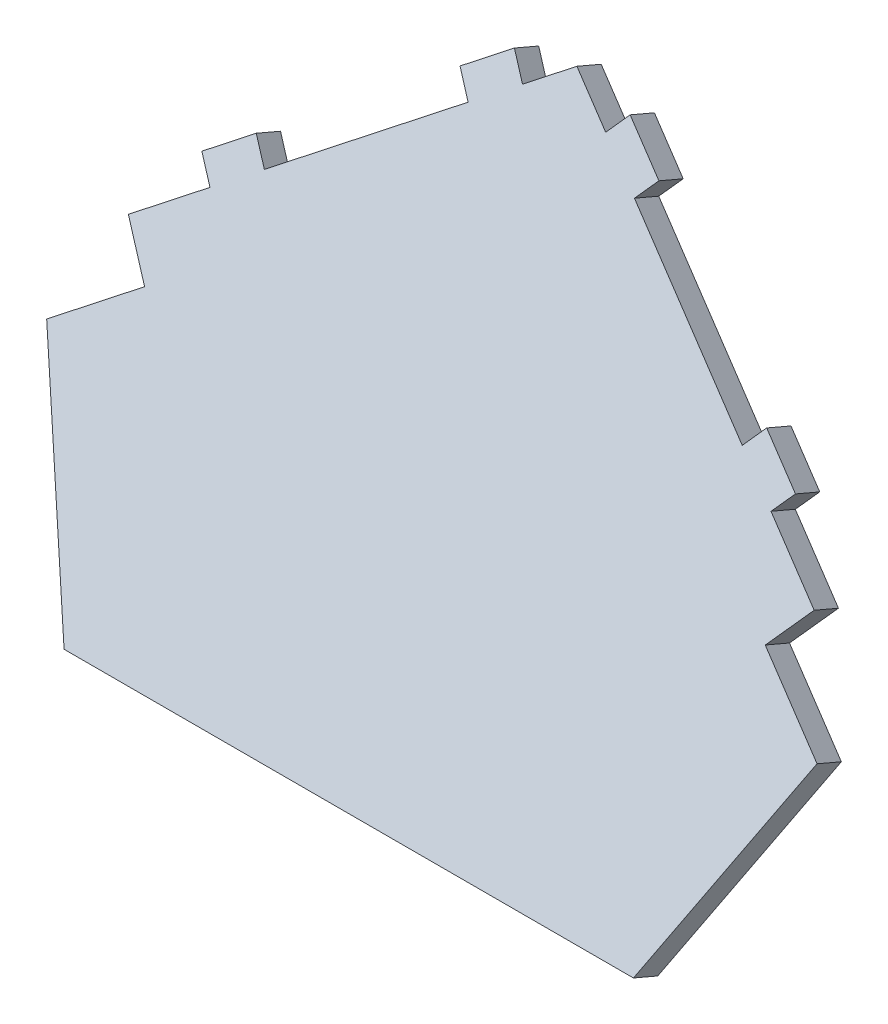
ISO-10303-21;
HEADER;
FILE_DESCRIPTION(('STEP AP214'),'2;1');
FILE_NAME('part.step','',(''),(''),'','','');
FILE_SCHEMA(('AUTOMOTIVE_DESIGN { 1 0 10303 214 1 1 1 1 }'));
ENDSEC;
DATA;
#1=APPLICATION_CONTEXT('core data for automotive mechanical design processes');
#2=APPLICATION_PROTOCOL_DEFINITION('international standard','automotive_design',2000,#1);
#3=PRODUCT_CONTEXT('',#1,'mechanical');
#4=PRODUCT('Part','Part','',(#3));
#5=PRODUCT_RELATED_PRODUCT_CATEGORY('part','',(#4));
#6=PRODUCT_DEFINITION_FORMATION('','',#4);
#7=PRODUCT_DEFINITION_CONTEXT('part definition',#1,'design');
#8=PRODUCT_DEFINITION('design','',#6,#7);
#9=PRODUCT_DEFINITION_SHAPE('','',#8);
#10=(LENGTH_UNIT() NAMED_UNIT(*) SI_UNIT(.MILLI.,.METRE.));
#11=(NAMED_UNIT(*) PLANE_ANGLE_UNIT() SI_UNIT($,.RADIAN.));
#12=(NAMED_UNIT(*) SI_UNIT($,.STERADIAN.) SOLID_ANGLE_UNIT());
#13=UNCERTAINTY_MEASURE_WITH_UNIT(LENGTH_MEASURE(1.E-05),#10,'distance_accuracy_value','');
#14=(GEOMETRIC_REPRESENTATION_CONTEXT(3) GLOBAL_UNCERTAINTY_ASSIGNED_CONTEXT((#13)) GLOBAL_UNIT_ASSIGNED_CONTEXT((#10,
#11,#12)) REPRESENTATION_CONTEXT('',''));
#15=CARTESIAN_POINT('',(0.,0.,0.));
#16=DIRECTION('',(0.,0.,1.));
#17=DIRECTION('',(1.,0.,0.));
#18=AXIS2_PLACEMENT_3D('',#15,#16,#17);
#19=CARTESIAN_POINT('',(0.,-9.20052588435934,-21.5016166865018));
#20=DIRECTION('',(0.,-0.393397156897283,-0.919368629519811));
#21=DIRECTION('',(0.,0.919368629519811,-0.393397156897283));
#22=AXIS2_PLACEMENT_3D('',#19,#20,#21);
#23=PLANE('',#22);
#24=DIRECTION('',(-0.787342411916439,-0.566805431330575,0.242535625036334));
#25=VECTOR('',#24,1.);
#26=CARTESIAN_POINT('',(-53.1157823784544,-40.2048775655227,-8.23487752314398));
#27=LINE('',#26,#25);
#28=CARTESIAN_POINT('',(-53.1157823784544,-40.2048775655227,-8.23487752314398));
#29=VERTEX_POINT('',#28);
#30=CARTESIAN_POINT('',(-64.9259185572009,-48.7069590354813,-4.59684314759898));
#31=VERTEX_POINT('',#30);
#32=EDGE_CURVE('E43',#29,#31,#27,.T.);
#33=ORIENTED_EDGE('',*,*,#32,.F.);
#34=DIRECTION('',(0.616515957942376,-0.723857914206439,0.309738266352574));
#35=VECTOR('',#34,1.);
#36=CARTESIAN_POINT('',(-53.1157823784544,-40.2048775655227,-8.23487752314398));
#37=LINE('',#36,#35);
#38=CARTESIAN_POINT('',(-56.1983621681663,-36.5855879944905,-9.78356885490686));
#39=VERTEX_POINT('',#38);
#40=EDGE_CURVE('E64',#39,#29,#37,.T.);
#41=ORIENTED_EDGE('',*,*,#40,.F.);
#42=DIRECTION('',(-0.787342411916438,-0.566805431330575,0.242535625036339));
#43=VECTOR('',#42,1.);
#44=CARTESIAN_POINT('',(-48.3249380490019,-30.9175336811847,-12.2089251052702));
#45=LINE('',#44,#43);
#46=CARTESIAN_POINT('',(-48.3249380490019,-30.9175336811847,-12.2089251052702));
#47=VERTEX_POINT('',#46);
#48=EDGE_CURVE('E73',#47,#39,#45,.T.);
#49=ORIENTED_EDGE('',*,*,#48,.F.);
#50=DIRECTION('',(-0.616515957942375,0.723857914206439,-0.309738266352574));
#51=VECTOR('',#50,1.);
#52=CARTESIAN_POINT('',(-48.3249380490019,-30.9175336811847,-12.2089251052702));
#53=LINE('',#52,#51);
#54=CARTESIAN_POINT('',(-45.24235825929,-34.5368232522169,-10.6602337735074));
#55=VERTEX_POINT('',#54);
#56=EDGE_CURVE('E80',#55,#47,#53,.T.);
#57=ORIENTED_EDGE('',*,*,#56,.F.);
#58=DIRECTION('',(-0.787342411916439,-0.566805431330577,0.24253562503633));
#59=VECTOR('',#58,1.);
#60=CARTESIAN_POINT('',(-15.7468482383288,-13.3030944110979,-19.7461306468723));
#61=LINE('',#60,#59);
#62=CARTESIAN_POINT('',(-15.7468482383288,-13.3030944110979,-19.7461306468723));
#63=VERTEX_POINT('',#62);
#64=EDGE_CURVE('E88',#63,#55,#61,.T.);
#65=ORIENTED_EDGE('',*,*,#64,.F.);
#66=DIRECTION('',(0.616515957942375,-0.72385791420644,0.309738266352575));
#67=VECTOR('',#66,1.);
#68=CARTESIAN_POINT('',(-18.8294280280407,-9.68380484006569,-21.2948219786352));
#69=LINE('',#68,#67);
#70=CARTESIAN_POINT('',(-18.8294280280407,-9.68380484006569,-21.2948219786352));
#71=VERTEX_POINT('',#70);
#72=EDGE_CURVE('E500',#71,#63,#69,.T.);
#73=ORIENTED_EDGE('',*,*,#72,.F.);
#74=DIRECTION('',(-0.787342411916439,-0.566805431330572,0.242535625036344));
#75=VECTOR('',#74,1.);
#76=CARTESIAN_POINT('',(-10.9560039088763,-4.01575052675998,-23.7201782289986));
#77=LINE('',#76,#75);
#78=CARTESIAN_POINT('',(-10.9560039088763,-4.01575052675998,-23.7201782289986));
#79=VERTEX_POINT('',#78);
#80=EDGE_CURVE('E486',#79,#71,#77,.T.);
#81=ORIENTED_EDGE('',*,*,#80,.F.);
#82=DIRECTION('',(-0.616515957942376,0.723857914206439,-0.309738266352575));
#83=VECTOR('',#82,1.);
#84=CARTESIAN_POINT('',(-7.87342411916439,-7.63504009779217,-22.1714868972357));
#85=LINE('',#84,#83);
#86=CARTESIAN_POINT('',(-7.87342411916439,-7.63504009779217,-22.1714868972357));
#87=VERTEX_POINT('',#86);
#88=EDGE_CURVE('E472',#87,#79,#85,.T.);
#89=ORIENTED_EDGE('',*,*,#88,.F.);
#90=DIRECTION('',(-0.787342411916439,-0.566805431330576,0.242535625036332));
#91=VECTOR('',#90,1.);
#92=CARTESIAN_POINT('',(0.,-1.96698578448641,-24.5968431475991));
#93=LINE('',#92,#91);
#94=CARTESIAN_POINT('',(0.,-1.96698578448641,-24.5968431475991));
#95=VERTEX_POINT('',#94);
#96=EDGE_CURVE('E458',#95,#87,#93,.T.);
#97=ORIENTED_EDGE('',*,*,#96,.F.);
#98=DIRECTION('',(-0.787342411916441,0.566805431330572,-0.242535625036335));
#99=VECTOR('',#98,1.);
#100=CARTESIAN_POINT('',(0.,-1.96698578448641,-24.5968431475991));
#101=LINE('',#100,#99);
#102=CARTESIAN_POINT('',(7.87342411916441,-7.63504009779213,-22.1714868972357));
#103=VERTEX_POINT('',#102);
#104=EDGE_CURVE('E444',#103,#95,#101,.T.);
#105=ORIENTED_EDGE('',*,*,#104,.F.);
#106=DIRECTION('',(-0.616515957942376,-0.723857914206438,0.309738266352575));
#107=VECTOR('',#106,1.);
#108=CARTESIAN_POINT('',(10.9560039088763,-4.01575052675994,-23.7201782289986));
#109=LINE('',#108,#107);
#110=CARTESIAN_POINT('',(10.9560039088763,-4.01575052675994,-23.7201782289986));
#111=VERTEX_POINT('',#110);
#112=EDGE_CURVE('E430',#111,#103,#109,.T.);
#113=ORIENTED_EDGE('',*,*,#112,.F.);
#114=DIRECTION('',(-0.787342411916439,0.566805431330576,-0.242535625036334));
#115=VECTOR('',#114,1.);
#116=CARTESIAN_POINT('',(18.8294280280407,-9.6838048400657,-21.2948219786352));
#117=LINE('',#116,#115);
#118=CARTESIAN_POINT('',(18.8294280280407,-9.6838048400657,-21.2948219786352));
#119=VERTEX_POINT('',#118);
#120=EDGE_CURVE('E416',#119,#111,#117,.T.);
#121=ORIENTED_EDGE('',*,*,#120,.F.);
#122=DIRECTION('',(0.616515957942376,0.723857914206438,-0.309738266352575));
#123=VECTOR('',#122,1.);
#124=CARTESIAN_POINT('',(15.7468482383288,-13.3030944110979,-19.7461306468724));
#125=LINE('',#124,#123);
#126=CARTESIAN_POINT('',(15.7468482383288,-13.3030944110979,-19.7461306468724));
#127=VERTEX_POINT('',#126);
#128=EDGE_CURVE('E402',#127,#119,#125,.T.);
#129=ORIENTED_EDGE('',*,*,#128,.F.);
#130=DIRECTION('',(-0.787342411916443,0.566805431330569,-0.242535625036335));
#131=VECTOR('',#130,1.);
#132=CARTESIAN_POINT('',(15.7468482383288,-13.3030944110979,-19.7461306468724));
#133=LINE('',#132,#131);
#134=CARTESIAN_POINT('',(45.2423582592895,-34.5368232522161,-10.6602337735075));
#135=VERTEX_POINT('',#134);
#136=EDGE_CURVE('E388',#135,#127,#133,.T.);
#137=ORIENTED_EDGE('',*,*,#136,.F.);
#138=DIRECTION('',(-0.616515957942372,-0.723857914206409,0.309738266352652));
#139=VECTOR('',#138,1.);
#140=CARTESIAN_POINT('',(48.3249380490013,-30.9175336811841,-12.2089251052707));
#141=LINE('',#140,#139);
#142=CARTESIAN_POINT('',(48.3249380490013,-30.9175336811841,-12.2089251052708));
#143=VERTEX_POINT('',#142);
#144=EDGE_CURVE('E374',#143,#135,#141,.T.);
#145=ORIENTED_EDGE('',*,*,#144,.F.);
#146=DIRECTION('',(-0.787342411916445,0.566805431330569,-0.242535625036328));
#147=VECTOR('',#146,1.);
#148=CARTESIAN_POINT('',(48.3249380490013,-30.9175336811841,-12.2089251052707));
#149=LINE('',#148,#147);
#150=CARTESIAN_POINT('',(56.1983621681658,-36.5855879944897,-9.78356885490747));
#151=VERTEX_POINT('',#150);
#152=EDGE_CURVE('E360',#151,#143,#149,.T.);
#153=ORIENTED_EDGE('',*,*,#152,.F.);
#154=DIRECTION('',(0.616515957942369,0.723857914206406,-0.309738266352663));
#155=VECTOR('',#154,1.);
#156=CARTESIAN_POINT('',(53.1157823784539,-40.2048775655218,-8.23487752314416));
#157=LINE('',#156,#155);
#158=CARTESIAN_POINT('',(53.1157823784539,-40.2048775655218,-8.23487752314416));
#159=VERTEX_POINT('',#158);
#160=EDGE_CURVE('E346',#159,#151,#157,.T.);
#161=ORIENTED_EDGE('',*,*,#160,.F.);
#162=DIRECTION('',(-0.787342411916422,0.5668054313306,-0.242535625036331));
#163=VECTOR('',#162,1.);
#164=CARTESIAN_POINT('',(53.1157823784539,-40.2048775655218,-8.23487752314416));
#165=LINE('',#164,#163);
#166=CARTESIAN_POINT('',(64.9259185572009,-48.7069590354813,-4.59684314759899));
#167=VERTEX_POINT('',#166);
#168=EDGE_CURVE('E332',#167,#159,#165,.T.);
#169=ORIENTED_EDGE('',*,*,#168,.F.);
#170=DIRECTION('',(0.616515957942376,0.723857914206438,-0.309738266352575));
#171=VECTOR('',#170,1.);
#172=CARTESIAN_POINT('',(64.9259185572009,-48.7069590354813,-4.59684314759899));
#173=LINE('',#172,#171);
#174=CARTESIAN_POINT('',(58.7607589777772,-55.9455381775457,-1.49946048407323));
#175=VERTEX_POINT('',#174);
#176=EDGE_CURVE('E318',#175,#167,#173,.T.);
#177=ORIENTED_EDGE('',*,*,#176,.F.);
#178=DIRECTION('',(-0.787342411916439,0.566805431330578,-0.242535625036327));
#179=VECTOR('',#178,1.);
#180=CARTESIAN_POINT('',(58.7607589777772,-55.9455381775457,-1.49946048407323));
#181=LINE('',#180,#179);
#182=CARTESIAN_POINT('',(72.9329223922731,-66.148035941496,2.86618076658065));
#183=VERTEX_POINT('',#182);
#184=EDGE_CURVE('E304',#183,#175,#181,.T.);
#185=ORIENTED_EDGE('',*,*,#184,.F.);
#186=DIRECTION('',(0.429599644457572,0.830207763544645,-0.355245288261684));
#187=VECTOR('',#186,1.);
#188=CARTESIAN_POINT('',(53.9034479059909,-102.922781122288,18.602067042472));
#189=LINE('',#188,#187);
#190=CARTESIAN_POINT('',(53.9034479059909,-102.922781122288,18.602067042472));
#191=VERTEX_POINT('',#190);
#192=EDGE_CURVE('E290',#191,#183,#189,.T.);
#193=ORIENTED_EDGE('',*,*,#192,.F.);
#194=DIRECTION('',(1.,0.,0.));
#195=VECTOR('',#194,1.);
#196=CARTESIAN_POINT('',(-53.9034479059908,-102.922781122288,18.602067042472));
#197=LINE('',#196,#195);
#198=CARTESIAN_POINT('',(-53.9034479059908,-102.922781122288,18.602067042472));
#199=VERTEX_POINT('',#198);
#200=EDGE_CURVE('E276',#199,#191,#197,.T.);
#201=ORIENTED_EDGE('',*,*,#200,.F.);
#202=DIRECTION('',(0.429599644457573,-0.830207763544644,0.355245288261683));
#203=VECTOR('',#202,1.);
#204=CARTESIAN_POINT('',(-72.932922392273,-66.1480359414961,2.86618076658068));
#205=LINE('',#204,#203);
#206=CARTESIAN_POINT('',(-72.932922392273,-66.1480359414961,2.86618076658068));
#207=VERTEX_POINT('',#206);
#208=EDGE_CURVE('E262',#207,#199,#205,.T.);
#209=ORIENTED_EDGE('',*,*,#208,.F.);
#210=DIRECTION('',(-0.787342411916438,-0.566805431330579,0.242535625036329));
#211=VECTOR('',#210,1.);
#212=CARTESIAN_POINT('',(-58.7607589777772,-55.9455381775457,-1.49946048407323));
#213=LINE('',#212,#211);
#214=CARTESIAN_POINT('',(-58.7607589777772,-55.9455381775457,-1.49946048407323));
#215=VERTEX_POINT('',#214);
#216=EDGE_CURVE('E239',#215,#207,#213,.T.);
#217=ORIENTED_EDGE('',*,*,#216,.F.);
#218=DIRECTION('',(0.616515957942377,-0.723857914206438,0.309738266352575));
#219=VECTOR('',#218,1.);
#220=CARTESIAN_POINT('',(-64.9259185572009,-48.7069590354813,-4.59684314759898));
#221=LINE('',#220,#219);
#222=EDGE_CURVE('E233',#31,#215,#221,.T.);
#223=ORIENTED_EDGE('',*,*,#222,.F.);
#224=EDGE_LOOP('',(#33,#41,#49,#57,#65,#73,#81,#89,#97,#105,#113,#121,#129,#137,#145,#153,#161,
#169,#177,#185,#193,#201,#209,#217,#223));
#225=FACE_BOUND('',#224,.T.);
#226=ADVANCED_FACE('F34',(#225),#23,.T.);
#227=CARTESIAN_POINT('',(0.,-7.23354009987293,-16.9047735389028));
#228=DIRECTION('',(0.,-0.393397156897283,-0.919368629519811));
#229=DIRECTION('',(0.,0.919368629519811,-0.393397156897283));
#230=AXIS2_PLACEMENT_3D('',#227,#228,#229);
#231=PLANE('',#230);
#232=DIRECTION('',(-0.787342411916439,-0.566805431330575,0.242535625036334));
#233=VECTOR('',#232,1.);
#234=CARTESIAN_POINT('',(-53.1157823784544,-38.2378917810362,-3.63803437554493));
#235=LINE('',#234,#233);
#236=CARTESIAN_POINT('',(-53.1157823784544,-38.2378917810362,-3.63803437554493));
#237=VERTEX_POINT('',#236);
#238=CARTESIAN_POINT('',(-64.9259185572009,-46.7399732509949,0.));
#239=VERTEX_POINT('',#238);
#240=EDGE_CURVE('E12',#237,#239,#235,.T.);
#241=ORIENTED_EDGE('',*,*,#240,.T.);
#242=DIRECTION('',(0.616515957942377,-0.723857914206438,0.309738266352575));
#243=VECTOR('',#242,1.);
#244=CARTESIAN_POINT('',(-64.9259185572009,-46.7399732509949,0.));
#245=LINE('',#244,#243);
#246=CARTESIAN_POINT('',(-58.7607589777772,-53.9785523930592,3.09738266352582));
#247=VERTEX_POINT('',#246);
#248=EDGE_CURVE('E228',#239,#247,#245,.T.);
#249=ORIENTED_EDGE('',*,*,#248,.T.);
#250=DIRECTION('',(-0.787342411916438,-0.566805431330579,0.242535625036329));
#251=VECTOR('',#250,1.);
#252=CARTESIAN_POINT('',(-58.7607589777772,-53.9785523930592,3.09738266352582));
#253=LINE('',#252,#251);
#254=CARTESIAN_POINT('',(-72.932922392273,-64.1810501570097,7.46302391417973));
#255=VERTEX_POINT('',#254);
#256=EDGE_CURVE('E240',#247,#255,#253,.T.);
#257=ORIENTED_EDGE('',*,*,#256,.T.);
#258=DIRECTION('',(0.429599644457573,-0.830207763544644,0.355245288261683));
#259=VECTOR('',#258,1.);
#260=CARTESIAN_POINT('',(-72.932922392273,-64.1810501570097,7.46302391417973));
#261=LINE('',#260,#259);
#262=CARTESIAN_POINT('',(-53.9034479059908,-100.955795337802,23.198910190071));
#263=VERTEX_POINT('',#262);
#264=EDGE_CURVE('E256',#255,#263,#261,.T.);
#265=ORIENTED_EDGE('',*,*,#264,.T.);
#266=DIRECTION('',(1.,0.,0.));
#267=VECTOR('',#266,1.);
#268=CARTESIAN_POINT('',(-53.9034479059908,-100.955795337802,23.198910190071));
#269=LINE('',#268,#267);
#270=CARTESIAN_POINT('',(53.9034479059909,-100.955795337802,23.198910190071));
#271=VERTEX_POINT('',#270);
#272=EDGE_CURVE('E270',#263,#271,#269,.T.);
#273=ORIENTED_EDGE('',*,*,#272,.T.);
#274=DIRECTION('',(0.429599644457572,0.830207763544645,-0.355245288261684));
#275=VECTOR('',#274,1.);
#276=CARTESIAN_POINT('',(53.9034479059909,-100.955795337802,23.198910190071));
#277=LINE('',#276,#275);
#278=CARTESIAN_POINT('',(72.9329223922731,-64.1810501570096,7.4630239141797));
#279=VERTEX_POINT('',#278);
#280=EDGE_CURVE('E284',#271,#279,#277,.T.);
#281=ORIENTED_EDGE('',*,*,#280,.T.);
#282=DIRECTION('',(-0.787342411916439,0.566805431330578,-0.242535625036327));
#283=VECTOR('',#282,1.);
#284=CARTESIAN_POINT('',(58.7607589777772,-53.9785523930592,3.09738266352582));
#285=LINE('',#284,#283);
#286=CARTESIAN_POINT('',(58.7607589777772,-53.9785523930592,3.09738266352582));
#287=VERTEX_POINT('',#286);
#288=EDGE_CURVE('E298',#279,#287,#285,.T.);
#289=ORIENTED_EDGE('',*,*,#288,.T.);
#290=DIRECTION('',(0.616515957942376,0.723857914206438,-0.309738266352575));
#291=VECTOR('',#290,1.);
#292=CARTESIAN_POINT('',(64.9259185572009,-46.7399732509949,0.));
#293=LINE('',#292,#291);
#294=CARTESIAN_POINT('',(64.9259185572009,-46.7399732509949,0.));
#295=VERTEX_POINT('',#294);
#296=EDGE_CURVE('E312',#287,#295,#293,.T.);
#297=ORIENTED_EDGE('',*,*,#296,.T.);
#298=DIRECTION('',(-0.787342411916422,0.5668054313306,-0.242535625036331));
#299=VECTOR('',#298,1.);
#300=CARTESIAN_POINT('',(53.1157823784539,-38.2378917810354,-3.6380343755451));
#301=LINE('',#300,#299);
#302=CARTESIAN_POINT('',(53.1157823784539,-38.2378917810354,-3.6380343755451));
#303=VERTEX_POINT('',#302);
#304=EDGE_CURVE('E326',#295,#303,#301,.T.);
#305=ORIENTED_EDGE('',*,*,#304,.T.);
#306=DIRECTION('',(0.616515957942369,0.723857914206406,-0.309738266352663));
#307=VECTOR('',#306,1.);
#308=CARTESIAN_POINT('',(53.1157823784539,-38.2378917810354,-3.6380343755451));
#309=LINE('',#308,#307);
#310=CARTESIAN_POINT('',(56.1983621681658,-34.6186022100033,-5.18672570730842));
#311=VERTEX_POINT('',#310);
#312=EDGE_CURVE('E340',#303,#311,#309,.T.);
#313=ORIENTED_EDGE('',*,*,#312,.T.);
#314=DIRECTION('',(-0.787342411916445,0.566805431330569,-0.242535625036328));
#315=VECTOR('',#314,1.);
#316=CARTESIAN_POINT('',(48.3249380490013,-28.9505478966976,-7.61208195767169));
#317=LINE('',#316,#315);
#318=CARTESIAN_POINT('',(48.3249380490013,-28.9505478966976,-7.61208195767169));
#319=VERTEX_POINT('',#318);
#320=EDGE_CURVE('E354',#311,#319,#317,.T.);
#321=ORIENTED_EDGE('',*,*,#320,.T.);
#322=DIRECTION('',(-0.616515957942372,-0.723857914206409,0.309738266352652));
#323=VECTOR('',#322,1.);
#324=CARTESIAN_POINT('',(48.3249380490013,-28.9505478966976,-7.61208195767169));
#325=LINE('',#324,#323);
#326=CARTESIAN_POINT('',(45.2423582592895,-32.5698374677297,-6.06339062590843));
#327=VERTEX_POINT('',#326);
#328=EDGE_CURVE('E368',#319,#327,#325,.T.);
#329=ORIENTED_EDGE('',*,*,#328,.T.);
#330=DIRECTION('',(-0.787342411916443,0.566805431330569,-0.242535625036335));
#331=VECTOR('',#330,1.);
#332=CARTESIAN_POINT('',(15.7468482383288,-11.3361086266115,-15.1492874992733));
#333=LINE('',#332,#331);
#334=CARTESIAN_POINT('',(15.7468482383288,-11.3361086266115,-15.1492874992733));
#335=VERTEX_POINT('',#334);
#336=EDGE_CURVE('E382',#327,#335,#333,.T.);
#337=ORIENTED_EDGE('',*,*,#336,.T.);
#338=DIRECTION('',(0.616515957942376,0.723857914206438,-0.309738266352575));
#339=VECTOR('',#338,1.);
#340=CARTESIAN_POINT('',(15.7468482383288,-11.3361086266115,-15.1492874992733));
#341=LINE('',#340,#339);
#342=CARTESIAN_POINT('',(18.8294280280407,-7.71681905557928,-16.6979788310362));
#343=VERTEX_POINT('',#342);
#344=EDGE_CURVE('E396',#335,#343,#341,.T.);
#345=ORIENTED_EDGE('',*,*,#344,.T.);
#346=DIRECTION('',(-0.787342411916439,0.566805431330576,-0.242535625036334));
#347=VECTOR('',#346,1.);
#348=CARTESIAN_POINT('',(18.8294280280407,-7.71681905557928,-16.6979788310362));
#349=LINE('',#348,#347);
#350=CARTESIAN_POINT('',(10.9560039088763,-2.04876474227353,-19.1233350813995));
#351=VERTEX_POINT('',#350);
#352=EDGE_CURVE('E410',#343,#351,#349,.T.);
#353=ORIENTED_EDGE('',*,*,#352,.T.);
#354=DIRECTION('',(-0.616515957942376,-0.723857914206438,0.309738266352575));
#355=VECTOR('',#354,1.);
#356=CARTESIAN_POINT('',(10.9560039088763,-2.04876474227353,-19.1233350813995));
#357=LINE('',#356,#355);
#358=CARTESIAN_POINT('',(7.87342411916441,-5.66805431330572,-17.5746437496367));
#359=VERTEX_POINT('',#358);
#360=EDGE_CURVE('E424',#351,#359,#357,.T.);
#361=ORIENTED_EDGE('',*,*,#360,.T.);
#362=DIRECTION('',(-0.787342411916441,0.566805431330572,-0.242535625036335));
#363=VECTOR('',#362,1.);
#364=CARTESIAN_POINT('',(0.,0.,-20.));
#365=LINE('',#364,#363);
#366=CARTESIAN_POINT('',(0.,0.,-20.));
#367=VERTEX_POINT('',#366);
#368=EDGE_CURVE('E438',#359,#367,#365,.T.);
#369=ORIENTED_EDGE('',*,*,#368,.T.);
#370=DIRECTION('',(-0.787342411916439,-0.566805431330576,0.242535625036332));
#371=VECTOR('',#370,1.);
#372=CARTESIAN_POINT('',(0.,0.,-20.));
#373=LINE('',#372,#371);
#374=CARTESIAN_POINT('',(-7.87342411916439,-5.66805431330576,-17.5746437496367));
#375=VERTEX_POINT('',#374);
#376=EDGE_CURVE('E452',#367,#375,#373,.T.);
#377=ORIENTED_EDGE('',*,*,#376,.T.);
#378=DIRECTION('',(-0.616515957942376,0.723857914206439,-0.309738266352575));
#379=VECTOR('',#378,1.);
#380=CARTESIAN_POINT('',(-7.87342411916439,-5.66805431330576,-17.5746437496367));
#381=LINE('',#380,#379);
#382=CARTESIAN_POINT('',(-10.9560039088763,-2.04876474227357,-19.1233350813996));
#383=VERTEX_POINT('',#382);
#384=EDGE_CURVE('E466',#375,#383,#381,.T.);
#385=ORIENTED_EDGE('',*,*,#384,.T.);
#386=DIRECTION('',(-0.787342411916439,-0.566805431330572,0.242535625036344));
#387=VECTOR('',#386,1.);
#388=CARTESIAN_POINT('',(-10.9560039088763,-2.04876474227357,-19.1233350813996));
#389=LINE('',#388,#387);
#390=CARTESIAN_POINT('',(-18.8294280280407,-7.71681905557928,-16.6979788310361));
#391=VERTEX_POINT('',#390);
#392=EDGE_CURVE('E480',#383,#391,#389,.T.);
#393=ORIENTED_EDGE('',*,*,#392,.T.);
#394=DIRECTION('',(0.616515957942375,-0.72385791420644,0.309738266352575));
#395=VECTOR('',#394,1.);
#396=CARTESIAN_POINT('',(-18.8294280280407,-7.71681905557928,-16.6979788310361));
#397=LINE('',#396,#395);
#398=CARTESIAN_POINT('',(-15.7468482383288,-11.3361086266115,-15.1492874992732));
#399=VERTEX_POINT('',#398);
#400=EDGE_CURVE('E494',#391,#399,#397,.T.);
#401=ORIENTED_EDGE('',*,*,#400,.T.);
#402=DIRECTION('',(-0.787342411916439,-0.566805431330577,0.24253562503633));
#403=VECTOR('',#402,1.);
#404=CARTESIAN_POINT('',(-15.7468482383288,-11.3361086266115,-15.1492874992732));
#405=LINE('',#404,#403);
#406=CARTESIAN_POINT('',(-45.24235825929,-32.5698374677305,-6.06339062590832));
#407=VERTEX_POINT('',#406);
#408=EDGE_CURVE('E105',#399,#407,#405,.T.);
#409=ORIENTED_EDGE('',*,*,#408,.T.);
#410=DIRECTION('',(-0.616515957942375,0.723857914206439,-0.309738266352574));
#411=VECTOR('',#410,1.);
#412=CARTESIAN_POINT('',(-48.3249380490019,-28.9505478966983,-7.61208195767119));
#413=LINE('',#412,#411);
#414=CARTESIAN_POINT('',(-48.3249380490019,-28.9505478966983,-7.61208195767119));
#415=VERTEX_POINT('',#414);
#416=EDGE_CURVE('E100',#407,#415,#413,.T.);
#417=ORIENTED_EDGE('',*,*,#416,.T.);
#418=DIRECTION('',(-0.787342411916438,-0.566805431330575,0.242535625036339));
#419=VECTOR('',#418,1.);
#420=CARTESIAN_POINT('',(-48.3249380490019,-28.9505478966983,-7.61208195767119));
#421=LINE('',#420,#419);
#422=CARTESIAN_POINT('',(-56.1983621681663,-34.618602210004,-5.1867257073078));
#423=VERTEX_POINT('',#422);
#424=EDGE_CURVE('E96',#415,#423,#421,.T.);
#425=ORIENTED_EDGE('',*,*,#424,.T.);
#426=DIRECTION('',(0.616515957942376,-0.723857914206439,0.309738266352574));
#427=VECTOR('',#426,1.);
#428=CARTESIAN_POINT('',(-53.1157823784544,-38.2378917810362,-3.63803437554493));
#429=LINE('',#428,#427);
#430=EDGE_CURVE('E540',#423,#237,#429,.T.);
#431=ORIENTED_EDGE('',*,*,#430,.T.);
#432=EDGE_LOOP('',(#241,#249,#257,#265,#273,#281,#289,#297,#305,#313,#321,#329,#337,#345,#353,
#361,#369,#377,#385,#393,#401,#409,#417,#425,#431));
#433=FACE_BOUND('',#432,.T.);
#434=ADVANCED_FACE('F559',(#433),#231,.F.);
#435=CARTESIAN_POINT('',(-53.1157823784544,-38.2378917810362,-3.63803437554493));
#436=DIRECTION('',(0.787342411916439,0.566805431330575,-0.242535625036335));
#437=DIRECTION('',(-0.584249665637435,0.811573981965012,0.));
#438=AXIS2_PLACEMENT_3D('',#435,#436,#437);
#439=PLANE('',#438);
#440=ORIENTED_EDGE('',*,*,#40,.T.);
#441=DIRECTION('',(0.,-0.393397156897282,-0.919368629519811));
#442=VECTOR('',#441,1.);
#443=CARTESIAN_POINT('',(-53.1157823784544,-38.2378917810362,-3.63803437554493));
#444=LINE('',#443,#442);
#445=EDGE_CURVE('E225',#237,#29,#444,.T.);
#446=ORIENTED_EDGE('',*,*,#445,.F.);
#447=ORIENTED_EDGE('',*,*,#430,.F.);
#448=DIRECTION('',(0.,-0.393397156897282,-0.919368629519811));
#449=VECTOR('',#448,1.);
#450=CARTESIAN_POINT('',(-56.1983621681663,-34.618602210004,-5.1867257073078));
#451=LINE('',#450,#449);
#452=EDGE_CURVE('E539',#423,#39,#451,.T.);
#453=ORIENTED_EDGE('',*,*,#452,.T.);
#454=EDGE_LOOP('',(#440,#446,#447,#453));
#455=FACE_BOUND('',#454,.T.);
#456=ADVANCED_FACE('F560',(#455),#439,.F.);
#457=CARTESIAN_POINT('',(-48.3249380490019,-28.9505478966983,-7.61208195767119));
#458=DIRECTION('',(0.616515957942377,-0.723857914206438,0.309738266352575));
#459=DIRECTION('',(0.76129709033642,0.648403223500085,0.));
#460=AXIS2_PLACEMENT_3D('',#457,#458,#459);
#461=PLANE('',#460);
#462=ORIENTED_EDGE('',*,*,#48,.T.);
#463=ORIENTED_EDGE('',*,*,#452,.F.);
#464=ORIENTED_EDGE('',*,*,#424,.F.);
#465=DIRECTION('',(0.,-0.393397156897282,-0.919368629519811));
#466=VECTOR('',#465,1.);
#467=CARTESIAN_POINT('',(-48.3249380490019,-28.9505478966983,-7.61208195767119));
#468=LINE('',#467,#466);
#469=EDGE_CURVE('E530',#415,#47,#468,.T.);
#470=ORIENTED_EDGE('',*,*,#469,.T.);
#471=EDGE_LOOP('',(#462,#463,#464,#470));
#472=FACE_BOUND('',#471,.T.);
#473=ADVANCED_FACE('F561',(#472),#461,.F.);
#474=CARTESIAN_POINT('',(-48.3249380490019,-28.9505478966983,-7.61208195767119));
#475=DIRECTION('',(-0.787342411916439,-0.566805431330575,0.242535625036335));
#476=DIRECTION('',(0.584249665637435,-0.811573981965012,0.));
#477=AXIS2_PLACEMENT_3D('',#474,#475,#476);
#478=PLANE('',#477);
#479=ORIENTED_EDGE('',*,*,#56,.T.);
#480=ORIENTED_EDGE('',*,*,#469,.F.);
#481=ORIENTED_EDGE('',*,*,#416,.F.);
#482=DIRECTION('',(0.,-0.393397156897282,-0.919368629519811));
#483=VECTOR('',#482,1.);
#484=CARTESIAN_POINT('',(-45.24235825929,-32.5698374677305,-6.06339062590832));
#485=LINE('',#484,#483);
#486=EDGE_CURVE('E520',#407,#55,#485,.T.);
#487=ORIENTED_EDGE('',*,*,#486,.T.);
#488=EDGE_LOOP('',(#479,#480,#481,#487));
#489=FACE_BOUND('',#488,.T.);
#490=ADVANCED_FACE('F563',(#489),#478,.F.);
#491=CARTESIAN_POINT('',(-15.7468482383288,-11.3361086266115,-15.1492874992732));
#492=DIRECTION('',(0.616515957942375,-0.723857914206439,0.309738266352576));
#493=DIRECTION('',(0.761297090336421,0.648403223500083,0.));
#494=AXIS2_PLACEMENT_3D('',#491,#492,#493);
#495=PLANE('',#494);
#496=ORIENTED_EDGE('',*,*,#64,.T.);
#497=ORIENTED_EDGE('',*,*,#486,.F.);
#498=ORIENTED_EDGE('',*,*,#408,.F.);
#499=DIRECTION('',(0.,-0.393397156897282,-0.919368629519811));
#500=VECTOR('',#499,1.);
#501=CARTESIAN_POINT('',(-15.7468482383288,-11.3361086266115,-15.1492874992732));
#502=LINE('',#501,#500);
#503=EDGE_CURVE('E510',#399,#63,#502,.T.);
#504=ORIENTED_EDGE('',*,*,#503,.T.);
#505=EDGE_LOOP('',(#496,#497,#498,#504));
#506=FACE_BOUND('',#505,.T.);
#507=ADVANCED_FACE('F569',(#506),#495,.F.);
#508=CARTESIAN_POINT('',(-18.8294280280407,-7.71681905557928,-16.6979788310361));
#509=DIRECTION('',(0.787342411916439,0.566805431330575,-0.242535625036335));
#510=DIRECTION('',(-0.584249665637434,0.811573981965012,0.));
#511=AXIS2_PLACEMENT_3D('',#508,#509,#510);
#512=PLANE('',#511);
#513=ORIENTED_EDGE('',*,*,#72,.T.);
#514=ORIENTED_EDGE('',*,*,#503,.F.);
#515=ORIENTED_EDGE('',*,*,#400,.F.);
#516=DIRECTION('',(0.,-0.393397156897282,-0.919368629519811));
#517=VECTOR('',#516,1.);
#518=CARTESIAN_POINT('',(-18.8294280280407,-7.71681905557928,-16.6979788310361));
#519=LINE('',#518,#517);
#520=EDGE_CURVE('E497',#391,#71,#519,.T.);
#521=ORIENTED_EDGE('',*,*,#520,.T.);
#522=EDGE_LOOP('',(#513,#514,#515,#521));
#523=FACE_BOUND('',#522,.T.);
#524=ADVANCED_FACE('F615',(#523),#512,.F.);
#525=CARTESIAN_POINT('',(-10.9560039088763,-2.04876474227357,-19.1233350813996));
#526=DIRECTION('',(0.616515957942376,-0.723857914206439,0.309738266352576));
#527=DIRECTION('',(0.761297090336421,0.648403223500084,0.));
#528=AXIS2_PLACEMENT_3D('',#525,#526,#527);
#529=PLANE('',#528);
#530=ORIENTED_EDGE('',*,*,#80,.T.);
#531=ORIENTED_EDGE('',*,*,#520,.F.);
#532=ORIENTED_EDGE('',*,*,#392,.F.);
#533=DIRECTION('',(0.,-0.393397156897282,-0.919368629519811));
#534=VECTOR('',#533,1.);
#535=CARTESIAN_POINT('',(-10.9560039088763,-2.04876474227357,-19.1233350813996));
#536=LINE('',#535,#534);
#537=EDGE_CURVE('E483',#383,#79,#536,.T.);
#538=ORIENTED_EDGE('',*,*,#537,.T.);
#539=EDGE_LOOP('',(#530,#531,#532,#538));
#540=FACE_BOUND('',#539,.T.);
#541=ADVANCED_FACE('F624',(#540),#529,.F.);
#542=CARTESIAN_POINT('',(-7.87342411916439,-5.66805431330576,-17.5746437496367));
#543=DIRECTION('',(-0.787342411916438,-0.566805431330576,0.242535625036335));
#544=DIRECTION('',(0.584249665637435,-0.811573981965012,0.));
#545=AXIS2_PLACEMENT_3D('',#542,#543,#544);
#546=PLANE('',#545);
#547=ORIENTED_EDGE('',*,*,#88,.T.);
#548=ORIENTED_EDGE('',*,*,#537,.F.);
#549=ORIENTED_EDGE('',*,*,#384,.F.);
#550=DIRECTION('',(0.,-0.393397156897282,-0.919368629519811));
#551=VECTOR('',#550,1.);
#552=CARTESIAN_POINT('',(-7.87342411916439,-5.66805431330576,-17.5746437496367));
#553=LINE('',#552,#551);
#554=EDGE_CURVE('E469',#375,#87,#553,.T.);
#555=ORIENTED_EDGE('',*,*,#554,.T.);
#556=EDGE_LOOP('',(#547,#548,#549,#555));
#557=FACE_BOUND('',#556,.T.);
#558=ADVANCED_FACE('F634',(#557),#546,.F.);
#559=CARTESIAN_POINT('',(0.,0.,-20.));
#560=DIRECTION('',(0.616515957942376,-0.723857914206439,0.309738266352576));
#561=DIRECTION('',(0.761297090336421,0.648403223500084,0.));
#562=AXIS2_PLACEMENT_3D('',#559,#560,#561);
#563=PLANE('',#562);
#564=ORIENTED_EDGE('',*,*,#96,.T.);
#565=ORIENTED_EDGE('',*,*,#554,.F.);
#566=ORIENTED_EDGE('',*,*,#376,.F.);
#567=DIRECTION('',(0.,-0.393397156897282,-0.919368629519811));
#568=VECTOR('',#567,1.);
#569=CARTESIAN_POINT('',(0.,0.,-20.));
#570=LINE('',#569,#568);
#571=EDGE_CURVE('E455',#367,#95,#570,.T.);
#572=ORIENTED_EDGE('',*,*,#571,.T.);
#573=EDGE_LOOP('',(#564,#565,#566,#572));
#574=FACE_BOUND('',#573,.T.);
#575=ADVANCED_FACE('F644',(#574),#563,.F.);
#576=CARTESIAN_POINT('',(0.,0.,-20.));
#577=DIRECTION('',(-0.616515957942372,-0.723857914206441,0.309738266352577));
#578=DIRECTION('',(0.761297090336424,-0.648403223500081,0.));
#579=AXIS2_PLACEMENT_3D('',#576,#577,#578);
#580=PLANE('',#579);
#581=ORIENTED_EDGE('',*,*,#104,.T.);
#582=ORIENTED_EDGE('',*,*,#571,.F.);
#583=ORIENTED_EDGE('',*,*,#368,.F.);
#584=DIRECTION('',(0.,-0.393397156897282,-0.919368629519811));
#585=VECTOR('',#584,1.);
#586=CARTESIAN_POINT('',(7.87342411916441,-5.66805431330572,-17.5746437496367));
#587=LINE('',#586,#585);
#588=EDGE_CURVE('E441',#359,#103,#587,.T.);
#589=ORIENTED_EDGE('',*,*,#588,.T.);
#590=EDGE_LOOP('',(#581,#582,#583,#589));
#591=FACE_BOUND('',#590,.T.);
#592=ADVANCED_FACE('F654',(#591),#580,.F.);
#593=CARTESIAN_POINT('',(10.9560039088763,-2.04876474227353,-19.1233350813995));
#594=DIRECTION('',(0.787342411916438,-0.566805431330576,0.242535625036335));
#595=DIRECTION('',(0.584249665637436,0.811573981965011,0.));
#596=AXIS2_PLACEMENT_3D('',#593,#594,#595);
#597=PLANE('',#596);
#598=ORIENTED_EDGE('',*,*,#112,.T.);
#599=ORIENTED_EDGE('',*,*,#588,.F.);
#600=ORIENTED_EDGE('',*,*,#360,.F.);
#601=DIRECTION('',(0.,-0.393397156897282,-0.919368629519811));
#602=VECTOR('',#601,1.);
#603=CARTESIAN_POINT('',(10.9560039088763,-2.04876474227353,-19.1233350813995));
#604=LINE('',#603,#602);
#605=EDGE_CURVE('E427',#351,#111,#604,.T.);
#606=ORIENTED_EDGE('',*,*,#605,.T.);
#607=EDGE_LOOP('',(#598,#599,#600,#606));
#608=FACE_BOUND('',#607,.T.);
#609=ADVANCED_FACE('F664',(#608),#597,.F.);
#610=CARTESIAN_POINT('',(18.8294280280407,-7.71681905557928,-16.6979788310362));
#611=DIRECTION('',(-0.616515957942376,-0.723857914206439,0.309738266352576));
#612=DIRECTION('',(0.761297090336421,-0.648403223500084,0.));
#613=AXIS2_PLACEMENT_3D('',#610,#611,#612);
#614=PLANE('',#613);
#615=ORIENTED_EDGE('',*,*,#120,.T.);
#616=ORIENTED_EDGE('',*,*,#605,.F.);
#617=ORIENTED_EDGE('',*,*,#352,.F.);
#618=DIRECTION('',(0.,-0.393397156897282,-0.919368629519811));
#619=VECTOR('',#618,1.);
#620=CARTESIAN_POINT('',(18.8294280280407,-7.71681905557928,-16.6979788310362));
#621=LINE('',#620,#619);
#622=EDGE_CURVE('E413',#343,#119,#621,.T.);
#623=ORIENTED_EDGE('',*,*,#622,.T.);
#624=EDGE_LOOP('',(#615,#616,#617,#623));
#625=FACE_BOUND('',#624,.T.);
#626=ADVANCED_FACE('F674',(#625),#614,.F.);
#627=CARTESIAN_POINT('',(15.7468482383288,-11.3361086266115,-15.1492874992733));
#628=DIRECTION('',(-0.787342411916438,0.566805431330576,-0.242535625036335));
#629=DIRECTION('',(-0.584249665637436,-0.811573981965011,0.));
#630=AXIS2_PLACEMENT_3D('',#627,#628,#629);
#631=PLANE('',#630);
#632=ORIENTED_EDGE('',*,*,#128,.T.);
#633=ORIENTED_EDGE('',*,*,#622,.F.);
#634=ORIENTED_EDGE('',*,*,#344,.F.);
#635=DIRECTION('',(0.,-0.393397156897282,-0.919368629519811));
#636=VECTOR('',#635,1.);
#637=CARTESIAN_POINT('',(15.7468482383288,-11.3361086266115,-15.1492874992733));
#638=LINE('',#637,#636);
#639=EDGE_CURVE('E399',#335,#127,#638,.T.);
#640=ORIENTED_EDGE('',*,*,#639,.T.);
#641=EDGE_LOOP('',(#632,#633,#634,#640));
#642=FACE_BOUND('',#641,.T.);
#643=ADVANCED_FACE('F684',(#642),#631,.F.);
#644=CARTESIAN_POINT('',(15.7468482383288,-11.3361086266115,-15.1492874992733));
#645=DIRECTION('',(-0.61651595794237,-0.723857914206443,0.309738266352577));
#646=DIRECTION('',(0.761297090336426,-0.648403223500078,0.));
#647=AXIS2_PLACEMENT_3D('',#644,#645,#646);
#648=PLANE('',#647);
#649=ORIENTED_EDGE('',*,*,#136,.T.);
#650=ORIENTED_EDGE('',*,*,#639,.F.);
#651=ORIENTED_EDGE('',*,*,#336,.F.);
#652=DIRECTION('',(0.,-0.393397156897282,-0.919368629519811));
#653=VECTOR('',#652,1.);
#654=CARTESIAN_POINT('',(45.2423582592895,-32.5698374677297,-6.06339062590843));
#655=LINE('',#654,#653);
#656=EDGE_CURVE('E385',#327,#135,#655,.T.);
#657=ORIENTED_EDGE('',*,*,#656,.T.);
#658=EDGE_LOOP('',(#649,#650,#651,#657));
#659=FACE_BOUND('',#658,.T.);
#660=ADVANCED_FACE('F694',(#659),#648,.F.);
#661=CARTESIAN_POINT('',(48.3249380490013,-28.9505478966976,-7.61208195767169));
#662=DIRECTION('',(0.787342411916441,-0.566805431330572,0.242535625036333));
#663=DIRECTION('',(0.584249665637431,0.811573981965015,0.));
#664=AXIS2_PLACEMENT_3D('',#661,#662,#663);
#665=PLANE('',#664);
#666=ORIENTED_EDGE('',*,*,#144,.T.);
#667=ORIENTED_EDGE('',*,*,#656,.F.);
#668=ORIENTED_EDGE('',*,*,#328,.F.);
#669=DIRECTION('',(0.,-0.393397156897282,-0.919368629519811));
#670=VECTOR('',#669,1.);
#671=CARTESIAN_POINT('',(48.3249380490013,-28.9505478966976,-7.61208195767169));
#672=LINE('',#671,#670);
#673=EDGE_CURVE('E371',#319,#143,#672,.T.);
#674=ORIENTED_EDGE('',*,*,#673,.T.);
#675=EDGE_LOOP('',(#666,#667,#668,#674));
#676=FACE_BOUND('',#675,.T.);
#677=ADVANCED_FACE('F704',(#676),#665,.F.);
#678=CARTESIAN_POINT('',(48.3249380490013,-28.9505478966976,-7.61208195767169));
#679=DIRECTION('',(-0.616515957942367,-0.723857914206445,0.309738266352578));
#680=DIRECTION('',(0.761297090336428,-0.648403223500075,0.));
#681=AXIS2_PLACEMENT_3D('',#678,#679,#680);
#682=PLANE('',#681);
#683=ORIENTED_EDGE('',*,*,#152,.T.);
#684=ORIENTED_EDGE('',*,*,#673,.F.);
#685=ORIENTED_EDGE('',*,*,#320,.F.);
#686=DIRECTION('',(0.,-0.393397156897282,-0.919368629519811));
#687=VECTOR('',#686,1.);
#688=CARTESIAN_POINT('',(56.1983621681658,-34.6186022100033,-5.18672570730842));
#689=LINE('',#688,#687);
#690=EDGE_CURVE('E357',#311,#151,#689,.T.);
#691=ORIENTED_EDGE('',*,*,#690,.T.);
#692=EDGE_LOOP('',(#683,#684,#685,#691));
#693=FACE_BOUND('',#692,.T.);
#694=ADVANCED_FACE('F714',(#693),#682,.F.);
#695=CARTESIAN_POINT('',(53.1157823784539,-38.2378917810354,-3.6380343755451));
#696=DIRECTION('',(-0.787342411916443,0.566805431330569,-0.242535625036332));
#697=DIRECTION('',(-0.584249665637429,-0.811573981965016,0.));
#698=AXIS2_PLACEMENT_3D('',#695,#696,#697);
#699=PLANE('',#698);
#700=ORIENTED_EDGE('',*,*,#160,.T.);
#701=ORIENTED_EDGE('',*,*,#690,.F.);
#702=ORIENTED_EDGE('',*,*,#312,.F.);
#703=DIRECTION('',(0.,-0.393397156897282,-0.919368629519811));
#704=VECTOR('',#703,1.);
#705=CARTESIAN_POINT('',(53.1157823784539,-38.2378917810354,-3.6380343755451));
#706=LINE('',#705,#704);
#707=EDGE_CURVE('E343',#303,#159,#706,.T.);
#708=ORIENTED_EDGE('',*,*,#707,.T.);
#709=EDGE_LOOP('',(#700,#701,#702,#708));
#710=FACE_BOUND('',#709,.T.);
#711=ADVANCED_FACE('F724',(#710),#699,.F.);
#712=CARTESIAN_POINT('',(53.1157823784539,-38.2378917810354,-3.6380343755451));
#713=DIRECTION('',(-0.616515957942397,-0.723857914206423,0.309738266352569));
#714=DIRECTION('',(0.761297090336403,-0.648403223500105,0.));
#715=AXIS2_PLACEMENT_3D('',#712,#713,#714);
#716=PLANE('',#715);
#717=ORIENTED_EDGE('',*,*,#168,.T.);
#718=ORIENTED_EDGE('',*,*,#707,.F.);
#719=ORIENTED_EDGE('',*,*,#304,.F.);
#720=DIRECTION('',(0.,-0.393397156897282,-0.919368629519811));
#721=VECTOR('',#720,1.);
#722=CARTESIAN_POINT('',(64.9259185572009,-46.7399732509949,0.));
#723=LINE('',#722,#721);
#724=EDGE_CURVE('E329',#295,#167,#723,.T.);
#725=ORIENTED_EDGE('',*,*,#724,.T.);
#726=EDGE_LOOP('',(#717,#718,#719,#725));
#727=FACE_BOUND('',#726,.T.);
#728=ADVANCED_FACE('F734',(#727),#716,.F.);
#729=CARTESIAN_POINT('',(64.9259185572009,-46.7399732509949,0.));
#730=DIRECTION('',(-0.787342411916438,0.566805431330576,-0.242535625036335));
#731=DIRECTION('',(-0.584249665637436,-0.811573981965011,0.));
#732=AXIS2_PLACEMENT_3D('',#729,#730,#731);
#733=PLANE('',#732);
#734=ORIENTED_EDGE('',*,*,#176,.T.);
#735=ORIENTED_EDGE('',*,*,#724,.F.);
#736=ORIENTED_EDGE('',*,*,#296,.F.);
#737=DIRECTION('',(0.,-0.393397156897282,-0.919368629519811));
#738=VECTOR('',#737,1.);
#739=CARTESIAN_POINT('',(58.7607589777772,-53.9785523930592,3.09738266352582));
#740=LINE('',#739,#738);
#741=EDGE_CURVE('E315',#287,#175,#740,.T.);
#742=ORIENTED_EDGE('',*,*,#741,.T.);
#743=EDGE_LOOP('',(#734,#735,#736,#742));
#744=FACE_BOUND('',#743,.T.);
#745=ADVANCED_FACE('F744',(#744),#733,.F.);
#746=CARTESIAN_POINT('',(58.7607589777772,-53.9785523930592,3.09738266352582));
#747=DIRECTION('',(-0.616515957942375,-0.723857914206439,0.309738266352576));
#748=DIRECTION('',(0.761297090336421,-0.648403223500083,0.));
#749=AXIS2_PLACEMENT_3D('',#746,#747,#748);
#750=PLANE('',#749);
#751=ORIENTED_EDGE('',*,*,#184,.T.);
#752=ORIENTED_EDGE('',*,*,#741,.F.);
#753=ORIENTED_EDGE('',*,*,#288,.F.);
#754=DIRECTION('',(0.,-0.393397156897282,-0.919368629519811));
#755=VECTOR('',#754,1.);
#756=CARTESIAN_POINT('',(72.9329223922731,-64.1810501570096,7.4630239141797));
#757=LINE('',#756,#755);
#758=EDGE_CURVE('E301',#279,#183,#757,.T.);
#759=ORIENTED_EDGE('',*,*,#758,.T.);
#760=EDGE_LOOP('',(#751,#752,#753,#759));
#761=FACE_BOUND('',#760,.T.);
#762=ADVANCED_FACE('F754',(#761),#750,.F.);
#763=CARTESIAN_POINT('',(53.9034479059909,-100.955795337802,23.198910190071));
#764=DIRECTION('',(-0.903019460190049,0.394960436367156,-0.169003278733692));
#765=DIRECTION('',(-0.400724664792978,-0.9161985281731,0.));
#766=AXIS2_PLACEMENT_3D('',#763,#764,#765);
#767=PLANE('',#766);
#768=ORIENTED_EDGE('',*,*,#192,.T.);
#769=ORIENTED_EDGE('',*,*,#758,.F.);
#770=ORIENTED_EDGE('',*,*,#280,.F.);
#771=DIRECTION('',(0.,-0.393397156897282,-0.919368629519811));
#772=VECTOR('',#771,1.);
#773=CARTESIAN_POINT('',(53.9034479059909,-100.955795337802,23.198910190071));
#774=LINE('',#773,#772);
#775=EDGE_CURVE('E287',#271,#191,#774,.T.);
#776=ORIENTED_EDGE('',*,*,#775,.T.);
#777=EDGE_LOOP('',(#768,#769,#770,#776));
#778=FACE_BOUND('',#777,.T.);
#779=ADVANCED_FACE('F764',(#778),#767,.F.);
#780=CARTESIAN_POINT('',(-53.9034479059908,-100.955795337802,23.198910190071));
#781=DIRECTION('',(0.,0.919368629519811,-0.393397156897282));
#782=DIRECTION('',(0.,0.393397156897282,0.919368629519811));
#783=AXIS2_PLACEMENT_3D('',#780,#781,#782);
#784=PLANE('',#783);
#785=ORIENTED_EDGE('',*,*,#200,.T.);
#786=ORIENTED_EDGE('',*,*,#775,.F.);
#787=ORIENTED_EDGE('',*,*,#272,.F.);
#788=DIRECTION('',(0.,-0.393397156897282,-0.919368629519811));
#789=VECTOR('',#788,1.);
#790=CARTESIAN_POINT('',(-53.9034479059908,-100.955795337802,23.198910190071));
#791=LINE('',#790,#789);
#792=EDGE_CURVE('E273',#263,#199,#791,.T.);
#793=ORIENTED_EDGE('',*,*,#792,.T.);
#794=EDGE_LOOP('',(#785,#786,#787,#793));
#795=FACE_BOUND('',#794,.T.);
#796=ADVANCED_FACE('F774',(#795),#784,.F.);
#797=CARTESIAN_POINT('',(-72.932922392273,-64.1810501570097,7.46302391417973));
#798=DIRECTION('',(0.903019460190048,0.394960436367157,-0.169003278733692));
#799=DIRECTION('',(-0.40072466479298,0.9161985281731,0.));
#800=AXIS2_PLACEMENT_3D('',#797,#798,#799);
#801=PLANE('',#800);
#802=ORIENTED_EDGE('',*,*,#208,.T.);
#803=ORIENTED_EDGE('',*,*,#792,.F.);
#804=ORIENTED_EDGE('',*,*,#264,.F.);
#805=DIRECTION('',(0.,-0.393397156897282,-0.919368629519811));
#806=VECTOR('',#805,1.);
#807=CARTESIAN_POINT('',(-72.932922392273,-64.1810501570097,7.46302391417973));
#808=LINE('',#807,#806);
#809=EDGE_CURVE('E259',#255,#207,#808,.T.);
#810=ORIENTED_EDGE('',*,*,#809,.T.);
#811=EDGE_LOOP('',(#802,#803,#804,#810));
#812=FACE_BOUND('',#811,.T.);
#813=ADVANCED_FACE('F784',(#812),#801,.F.);
#814=CARTESIAN_POINT('',(-58.7607589777772,-53.9785523930592,3.09738266352582));
#815=DIRECTION('',(0.616515957942376,-0.723857914206438,0.309738266352575));
#816=DIRECTION('',(0.76129709033642,0.648403223500084,0.));
#817=AXIS2_PLACEMENT_3D('',#814,#815,#816);
#818=PLANE('',#817);
#819=ORIENTED_EDGE('',*,*,#216,.T.);
#820=ORIENTED_EDGE('',*,*,#809,.F.);
#821=ORIENTED_EDGE('',*,*,#256,.F.);
#822=DIRECTION('',(0.,-0.393397156897282,-0.919368629519811));
#823=VECTOR('',#822,1.);
#824=CARTESIAN_POINT('',(-58.7607589777772,-53.9785523930592,3.09738266352582));
#825=LINE('',#824,#823);
#826=EDGE_CURVE('E243',#247,#215,#825,.T.);
#827=ORIENTED_EDGE('',*,*,#826,.T.);
#828=EDGE_LOOP('',(#819,#820,#821,#827));
#829=FACE_BOUND('',#828,.T.);
#830=ADVANCED_FACE('F577',(#829),#818,.F.);
#831=CARTESIAN_POINT('',(-64.9259185572009,-46.7399732509949,0.));
#832=DIRECTION('',(0.787342411916438,0.566805431330576,-0.242535625036335));
#833=DIRECTION('',(-0.584249665637436,0.811573981965011,0.));
#834=AXIS2_PLACEMENT_3D('',#831,#832,#833);
#835=PLANE('',#834);
#836=ORIENTED_EDGE('',*,*,#222,.T.);
#837=ORIENTED_EDGE('',*,*,#826,.F.);
#838=ORIENTED_EDGE('',*,*,#248,.F.);
#839=DIRECTION('',(0.,-0.393397156897282,-0.919368629519811));
#840=VECTOR('',#839,1.);
#841=CARTESIAN_POINT('',(-64.9259185572009,-46.7399732509949,0.));
#842=LINE('',#841,#840);
#843=EDGE_CURVE('E224',#239,#31,#842,.T.);
#844=ORIENTED_EDGE('',*,*,#843,.T.);
#845=EDGE_LOOP('',(#836,#837,#838,#844));
#846=FACE_BOUND('',#845,.T.);
#847=ADVANCED_FACE('F231',(#846),#835,.F.);
#848=CARTESIAN_POINT('',(-53.1157823784544,-38.2378917810362,-3.63803437554493));
#849=DIRECTION('',(0.616515957942375,-0.723857914206439,0.309738266352576));
#850=DIRECTION('',(0.761297090336421,0.648403223500083,0.));
#851=AXIS2_PLACEMENT_3D('',#848,#849,#850);
#852=PLANE('',#851);
#853=ORIENTED_EDGE('',*,*,#32,.T.);
#854=ORIENTED_EDGE('',*,*,#843,.F.);
#855=ORIENTED_EDGE('',*,*,#240,.F.);
#856=ORIENTED_EDGE('',*,*,#445,.T.);
#857=EDGE_LOOP('',(#853,#854,#855,#856));
#858=FACE_BOUND('',#857,.T.);
#859=ADVANCED_FACE('F223',(#858),#852,.F.);
#860=CLOSED_SHELL('',(#226,#434,#456,#473,#490,#507,#524,#541,#558,#575,#592,#609,#626,#643,
#660,#677,#694,#711,#728,#745,#762,#779,#796,#813,#830,#847,#859));
#861=MANIFOLD_SOLID_BREP('B2',#860);
#862=ADVANCED_BREP_SHAPE_REPRESENTATION('',(#18,#861),#14);
#863=SHAPE_DEFINITION_REPRESENTATION(#9,#862);
ENDSEC;
END-ISO-10303-21;
